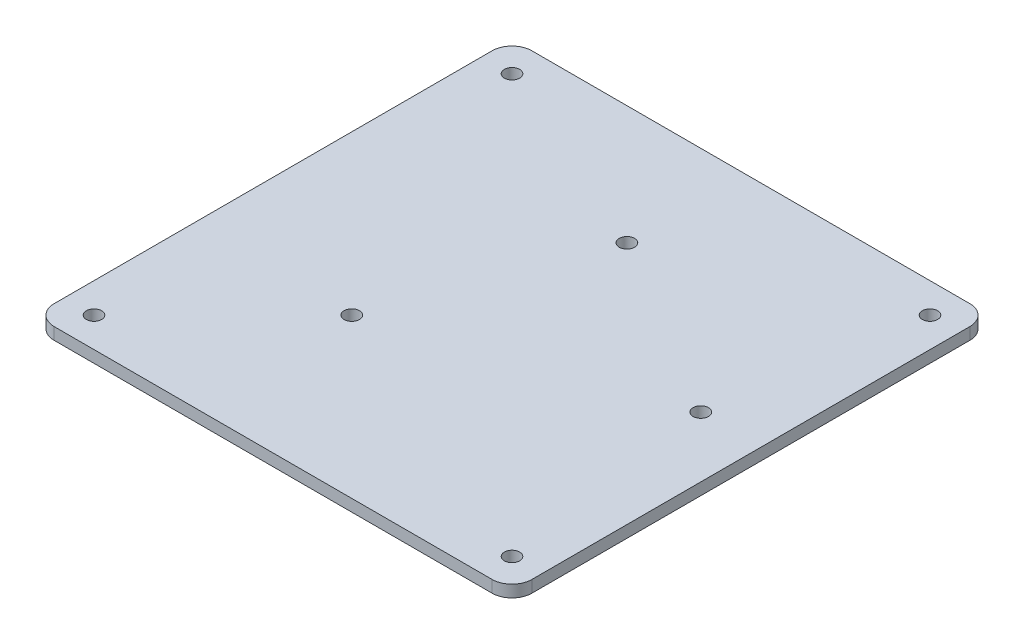
ISO-10303-21;
HEADER;
FILE_DESCRIPTION(('STEP AP214'),'2;1');
FILE_NAME('part.step','',(''),(''),'','','');
FILE_SCHEMA(('AUTOMOTIVE_DESIGN { 1 0 10303 214 1 1 1 1 }'));
ENDSEC;
DATA;
#1=APPLICATION_CONTEXT('core data for automotive mechanical design processes');
#2=APPLICATION_PROTOCOL_DEFINITION('international standard','automotive_design',2000,#1);
#3=PRODUCT_CONTEXT('',#1,'mechanical');
#4=PRODUCT('Part','Part','',(#3));
#5=PRODUCT_RELATED_PRODUCT_CATEGORY('part','',(#4));
#6=PRODUCT_DEFINITION_FORMATION('','',#4);
#7=PRODUCT_DEFINITION_CONTEXT('part definition',#1,'design');
#8=PRODUCT_DEFINITION('design','',#6,#7);
#9=PRODUCT_DEFINITION_SHAPE('','',#8);
#10=(LENGTH_UNIT() NAMED_UNIT(*) SI_UNIT(.MILLI.,.METRE.));
#11=(NAMED_UNIT(*) PLANE_ANGLE_UNIT() SI_UNIT($,.RADIAN.));
#12=(NAMED_UNIT(*) SI_UNIT($,.STERADIAN.) SOLID_ANGLE_UNIT());
#13=UNCERTAINTY_MEASURE_WITH_UNIT(LENGTH_MEASURE(1.E-05),#10,'distance_accuracy_value','');
#14=(GEOMETRIC_REPRESENTATION_CONTEXT(3) GLOBAL_UNCERTAINTY_ASSIGNED_CONTEXT((#13)) GLOBAL_UNIT_ASSIGNED_CONTEXT((#10,
#11,#12)) REPRESENTATION_CONTEXT('',''));
#15=CARTESIAN_POINT('',(0.,0.,0.));
#16=DIRECTION('',(0.,0.,1.));
#17=DIRECTION('',(1.,0.,0.));
#18=AXIS2_PLACEMENT_3D('',#15,#16,#17);
#19=CARTESIAN_POINT('',(-46.2541002310008,3.81,16.993426234333));
#20=DIRECTION('',(0.,1.,0.));
#21=DIRECTION('',(1.,0.,0.));
#22=AXIS2_PLACEMENT_3D('',#19,#20,#21);
#23=PLANE('',#22);
#24=CARTESIAN_POINT('',(-101.750340264647,3.81,34.3235777534356));
#25=DIRECTION('',(0.,1.,0.));
#26=DIRECTION('',(0.,0.,1.));
#27=AXIS2_PLACEMENT_3D('',#24,#25,#26);
#28=CIRCLE('',#27,2.45745);
#29=CARTESIAN_POINT('',(-101.750340264647,3.81,36.7810277534356));
#30=VERTEX_POINT('',#29);
#31=EDGE_CURVE('E145',#30,#30,#28,.T.);
#32=ORIENTED_EDGE('',*,*,#31,.F.);
#33=EDGE_LOOP('',(#32));
#34=FACE_BOUND('',#33,.T.);
#35=DIRECTION('',(0.,0.,1.));
#36=VECTOR('',#35,1.);
#37=CARTESIAN_POINT('',(0.,3.81000000000001,-67.4267625112118));
#38=LINE('',#37,#36);
#39=CARTESIAN_POINT('',(0.,3.81000000000001,-61.0767625112118));
#40=VERTEX_POINT('',#39);
#41=CARTESIAN_POINT('',(0.,3.80999999999999,78.6232374887882));
#42=VERTEX_POINT('',#41);
#43=EDGE_CURVE('E103',#40,#42,#38,.T.);
#44=ORIENTED_EDGE('',*,*,#43,.F.);
#45=CARTESIAN_POINT('',(-6.35,3.81000000000001,-61.0767625112118));
#46=DIRECTION('',(0.,1.,0.));
#47=DIRECTION('',(1.,0.,0.));
#48=AXIS2_PLACEMENT_3D('',#45,#46,#47);
#49=CIRCLE('',#48,6.35);
#50=CARTESIAN_POINT('',(-6.35,3.81000000000001,-67.4267625112118));
#51=VERTEX_POINT('',#50);
#52=EDGE_CURVE('E108',#51,#40,#49,.F.);
#53=ORIENTED_EDGE('',*,*,#52,.F.);
#54=DIRECTION('',(1.,0.,0.));
#55=VECTOR('',#54,1.);
#56=CARTESIAN_POINT('',(0.,3.81000000000001,-67.4267625112118));
#57=LINE('',#56,#55);
#58=CARTESIAN_POINT('',(-146.05,3.81000000000001,-67.4267625112118));
#59=VERTEX_POINT('',#58);
#60=EDGE_CURVE('E115',#59,#51,#57,.T.);
#61=ORIENTED_EDGE('',*,*,#60,.F.);
#62=CARTESIAN_POINT('',(-146.05,3.81000000000001,-61.0767625112118));
#63=DIRECTION('',(0.,-1.,0.));
#64=DIRECTION('',(-1.,0.,0.));
#65=AXIS2_PLACEMENT_3D('',#62,#63,#64);
#66=CIRCLE('',#65,6.35);
#67=CARTESIAN_POINT('',(-152.4,3.81000000000001,-61.0767625112118));
#68=VERTEX_POINT('',#67);
#69=EDGE_CURVE('E158',#59,#68,#66,.F.);
#70=ORIENTED_EDGE('',*,*,#69,.T.);
#71=DIRECTION('',(0.,0.,1.));
#72=VECTOR('',#71,1.);
#73=CARTESIAN_POINT('',(-152.4,3.81000000000001,-67.4267625112118));
#74=LINE('',#73,#72);
#75=CARTESIAN_POINT('',(-152.4,3.81,78.6232374887882));
#76=VERTEX_POINT('',#75);
#77=EDGE_CURVE('E116',#68,#76,#74,.T.);
#78=ORIENTED_EDGE('',*,*,#77,.T.);
#79=CARTESIAN_POINT('',(-146.05,3.81,78.6232374887882));
#80=DIRECTION('',(0.,-1.,0.));
#81=DIRECTION('',(-1.,0.,0.));
#82=AXIS2_PLACEMENT_3D('',#79,#80,#81);
#83=CIRCLE('',#82,6.35);
#84=CARTESIAN_POINT('',(-146.05,3.81,84.9732374887882));
#85=VERTEX_POINT('',#84);
#86=EDGE_CURVE('E160',#76,#85,#83,.F.);
#87=ORIENTED_EDGE('',*,*,#86,.T.);
#88=DIRECTION('',(1.,0.,0.));
#89=VECTOR('',#88,1.);
#90=CARTESIAN_POINT('',(0.,3.80999999999999,84.9732374887882));
#91=LINE('',#90,#89);
#92=CARTESIAN_POINT('',(-6.35,3.80999999999999,84.9732374887882));
#93=VERTEX_POINT('',#92);
#94=EDGE_CURVE('E180',#85,#93,#91,.T.);
#95=ORIENTED_EDGE('',*,*,#94,.T.);
#96=CARTESIAN_POINT('',(-6.35,3.80999999999999,78.6232374887882));
#97=DIRECTION('',(0.,-1.,0.));
#98=DIRECTION('',(-1.,0.,0.));
#99=AXIS2_PLACEMENT_3D('',#96,#97,#98);
#100=CIRCLE('',#99,6.35);
#101=EDGE_CURVE('E111',#93,#42,#100,.F.);
#102=ORIENTED_EDGE('',*,*,#101,.T.);
#103=EDGE_LOOP('',(#44,#53,#61,#70,#78,#87,#95,#102));
#104=FACE_BOUND('',#103,.T.);
#105=CARTESIAN_POINT('',(-19.302860594839,3.81,5.43816370851094));
#106=DIRECTION('',(0.,1.,0.));
#107=DIRECTION('',(1.,0.,0.));
#108=AXIS2_PLACEMENT_3D('',#105,#106,#107);
#109=CIRCLE('',#108,2.45744999999999);
#110=CARTESIAN_POINT('',(-16.845410594839,3.81,5.43816370851094));
#111=VERTEX_POINT('',#110);
#112=EDGE_CURVE('E133',#111,#111,#109,.F.);
#113=ORIENTED_EDGE('',*,*,#112,.T.);
#114=EDGE_LOOP('',(#113));
#115=FACE_BOUND('',#114,.T.);
#116=CARTESIAN_POINT('',(-77.848643242643,3.81000000000001,-29.5244167762885));
#117=DIRECTION('',(0.,1.,0.));
#118=DIRECTION('',(1.,0.,0.));
#119=AXIS2_PLACEMENT_3D('',#116,#117,#118);
#120=CIRCLE('',#119,2.45744999999999);
#121=CARTESIAN_POINT('',(-75.3911932426431,3.81000000000001,-29.5244167762885));
#122=VERTEX_POINT('',#121);
#123=EDGE_CURVE('E139',#122,#122,#120,.F.);
#124=ORIENTED_EDGE('',*,*,#123,.T.);
#125=EDGE_LOOP('',(#124));
#126=FACE_BOUND('',#125,.T.);
#127=CARTESIAN_POINT('',(-9.52499999999998,3.81000000000001,-57.9017625112118));
#128=DIRECTION('',(0.,1.,0.));
#129=DIRECTION('',(1.,0.,0.));
#130=AXIS2_PLACEMENT_3D('',#127,#128,#129);
#131=CIRCLE('',#130,2.4384);
#132=CARTESIAN_POINT('',(-7.08659999999998,3.81000000000001,-57.9017625112118));
#133=VERTEX_POINT('',#132);
#134=EDGE_CURVE('E128',#133,#133,#131,.F.);
#135=ORIENTED_EDGE('',*,*,#134,.T.);
#136=EDGE_LOOP('',(#135));
#137=FACE_BOUND('',#136,.T.);
#138=CARTESIAN_POINT('',(-142.875,3.81,75.4482374887882));
#139=DIRECTION('',(0.,1.,0.));
#140=DIRECTION('',(1.,0.,0.));
#141=AXIS2_PLACEMENT_3D('',#138,#139,#140);
#142=CIRCLE('',#141,2.43840000000001);
#143=CARTESIAN_POINT('',(-140.4366,3.81,75.4482374887882));
#144=VERTEX_POINT('',#143);
#145=EDGE_CURVE('E198',#144,#144,#142,.T.);
#146=ORIENTED_EDGE('',*,*,#145,.F.);
#147=EDGE_LOOP('',(#146));
#148=FACE_BOUND('',#147,.T.);
#149=CARTESIAN_POINT('',(-9.52499999999996,3.80999999999999,75.4482374887882));
#150=DIRECTION('',(0.,1.,0.));
#151=DIRECTION('',(1.,0.,0.));
#152=AXIS2_PLACEMENT_3D('',#149,#150,#151);
#153=CIRCLE('',#152,2.4384);
#154=CARTESIAN_POINT('',(-7.08659999999996,3.80999999999999,75.4482374887882));
#155=VERTEX_POINT('',#154);
#156=EDGE_CURVE('E204',#155,#155,#153,.T.);
#157=ORIENTED_EDGE('',*,*,#156,.F.);
#158=EDGE_LOOP('',(#157));
#159=FACE_BOUND('',#158,.T.);
#160=CARTESIAN_POINT('',(-142.875,3.81000000000001,-57.9017625112118));
#161=DIRECTION('',(0.,1.,0.));
#162=DIRECTION('',(1.,0.,0.));
#163=AXIS2_PLACEMENT_3D('',#160,#161,#162);
#164=CIRCLE('',#163,2.4384);
#165=CARTESIAN_POINT('',(-140.4366,3.81000000000001,-57.9017625112118));
#166=VERTEX_POINT('',#165);
#167=EDGE_CURVE('E189',#166,#166,#164,.T.);
#168=ORIENTED_EDGE('',*,*,#167,.F.);
#169=EDGE_LOOP('',(#168));
#170=FACE_BOUND('',#169,.T.);
#171=ADVANCED_FACE('F36',(#34,#104,#115,#126,#137,#148,#159,#170),#23,.T.);
#172=CARTESIAN_POINT('',(0.,3.81000000000001,-67.4267625112118));
#173=DIRECTION('',(0.,0.,-1.));
#174=DIRECTION('',(-1.,0.,0.));
#175=AXIS2_PLACEMENT_3D('',#172,#173,#174);
#176=PLANE('',#175);
#177=ORIENTED_EDGE('',*,*,#60,.T.);
#178=DIRECTION('',(0.,-1.,0.));
#179=VECTOR('',#178,1.);
#180=CARTESIAN_POINT('',(-6.35,0.,-67.4267625112118));
#181=LINE('',#180,#179);
#182=CARTESIAN_POINT('',(-6.35,0.,-67.4267625112118));
#183=VERTEX_POINT('',#182);
#184=EDGE_CURVE('E39',#51,#183,#181,.T.);
#185=ORIENTED_EDGE('',*,*,#184,.T.);
#186=DIRECTION('',(-1.,0.,0.));
#187=VECTOR('',#186,1.);
#188=CARTESIAN_POINT('',(0.,0.,-67.4267625112118));
#189=LINE('',#188,#187);
#190=CARTESIAN_POINT('',(-146.05,0.,-67.4267625112118));
#191=VERTEX_POINT('',#190);
#192=EDGE_CURVE('E183',#183,#191,#189,.T.);
#193=ORIENTED_EDGE('',*,*,#192,.T.);
#194=DIRECTION('',(0.,1.,0.));
#195=VECTOR('',#194,1.);
#196=CARTESIAN_POINT('',(-146.05,3.81000000000001,-67.4267625112118));
#197=LINE('',#196,#195);
#198=EDGE_CURVE('E171',#191,#59,#197,.T.);
#199=ORIENTED_EDGE('',*,*,#198,.T.);
#200=EDGE_LOOP('',(#177,#185,#193,#199));
#201=FACE_BOUND('',#200,.T.);
#202=ADVANCED_FACE('F222',(#201),#176,.T.);
#203=CARTESIAN_POINT('',(-146.05,3.81000000000001,-61.0767625112118));
#204=DIRECTION('',(0.,-1.,0.));
#205=DIRECTION('',(-1.,0.,0.));
#206=AXIS2_PLACEMENT_3D('',#203,#204,#205);
#207=CYLINDRICAL_SURFACE('',#206,6.35);
#208=CARTESIAN_POINT('',(-146.05,0.,-61.0767625112118));
#209=DIRECTION('',(0.,1.,0.));
#210=DIRECTION('',(1.,0.,0.));
#211=AXIS2_PLACEMENT_3D('',#208,#209,#210);
#212=CIRCLE('',#211,6.35);
#213=CARTESIAN_POINT('',(-152.4,0.,-61.0767625112118));
#214=VERTEX_POINT('',#213);
#215=EDGE_CURVE('E59',#214,#191,#212,.F.);
#216=ORIENTED_EDGE('',*,*,#215,.F.);
#217=DIRECTION('',(0.,1.,0.));
#218=VECTOR('',#217,1.);
#219=CARTESIAN_POINT('',(-152.4,0.,-61.0767625112118));
#220=LINE('',#219,#218);
#221=EDGE_CURVE('E153',#68,#214,#220,.F.);
#222=ORIENTED_EDGE('',*,*,#221,.F.);
#223=ORIENTED_EDGE('',*,*,#69,.F.);
#224=ORIENTED_EDGE('',*,*,#198,.F.);
#225=EDGE_LOOP('',(#216,#222,#223,#224));
#226=FACE_BOUND('',#225,.T.);
#227=ADVANCED_FACE('F262',(#226),#207,.T.);
#228=CARTESIAN_POINT('',(-152.4,3.81000000000001,-67.4267625112118));
#229=DIRECTION('',(1.,0.,0.));
#230=DIRECTION('',(0.,0.,-1.));
#231=AXIS2_PLACEMENT_3D('',#228,#229,#230);
#232=PLANE('',#231);
#233=ORIENTED_EDGE('',*,*,#77,.F.);
#234=ORIENTED_EDGE('',*,*,#221,.T.);
#235=DIRECTION('',(0.,0.,1.));
#236=VECTOR('',#235,1.);
#237=CARTESIAN_POINT('',(-152.4,0.,-67.4267625112118));
#238=LINE('',#237,#236);
#239=CARTESIAN_POINT('',(-152.4,0.,78.6232374887882));
#240=VERTEX_POINT('',#239);
#241=EDGE_CURVE('E175',#214,#240,#238,.T.);
#242=ORIENTED_EDGE('',*,*,#241,.T.);
#243=DIRECTION('',(0.,1.,0.));
#244=VECTOR('',#243,1.);
#245=CARTESIAN_POINT('',(-152.4,3.81,78.6232374887882));
#246=LINE('',#245,#244);
#247=EDGE_CURVE('E155',#240,#76,#246,.T.);
#248=ORIENTED_EDGE('',*,*,#247,.T.);
#249=EDGE_LOOP('',(#233,#234,#242,#248));
#250=FACE_BOUND('',#249,.T.);
#251=ADVANCED_FACE('F276',(#250),#232,.F.);
#252=CARTESIAN_POINT('',(-146.05,3.81,78.6232374887882));
#253=DIRECTION('',(0.,1.,0.));
#254=DIRECTION('',(1.,0.,0.));
#255=AXIS2_PLACEMENT_3D('',#252,#253,#254);
#256=CYLINDRICAL_SURFACE('',#255,6.35);
#257=CARTESIAN_POINT('',(-146.05,0.,78.6232374887882));
#258=DIRECTION('',(0.,1.,0.));
#259=DIRECTION('',(1.,0.,0.));
#260=AXIS2_PLACEMENT_3D('',#257,#258,#259);
#261=CIRCLE('',#260,6.35);
#262=CARTESIAN_POINT('',(-146.05,0.,84.9732374887882));
#263=VERTEX_POINT('',#262);
#264=EDGE_CURVE('E167',#263,#240,#261,.F.);
#265=ORIENTED_EDGE('',*,*,#264,.F.);
#266=DIRECTION('',(0.,1.,0.));
#267=VECTOR('',#266,1.);
#268=CARTESIAN_POINT('',(-146.05,3.81,84.9732374887882));
#269=LINE('',#268,#267);
#270=EDGE_CURVE('E127',#85,#263,#269,.F.);
#271=ORIENTED_EDGE('',*,*,#270,.F.);
#272=ORIENTED_EDGE('',*,*,#86,.F.);
#273=ORIENTED_EDGE('',*,*,#247,.F.);
#274=EDGE_LOOP('',(#265,#271,#272,#273));
#275=FACE_BOUND('',#274,.T.);
#276=ADVANCED_FACE('F278',(#275),#256,.T.);
#277=CARTESIAN_POINT('',(0.,3.80999999999999,84.9732374887882));
#278=DIRECTION('',(0.,0.,-1.));
#279=DIRECTION('',(-1.,0.,0.));
#280=AXIS2_PLACEMENT_3D('',#277,#278,#279);
#281=PLANE('',#280);
#282=ORIENTED_EDGE('',*,*,#94,.F.);
#283=ORIENTED_EDGE('',*,*,#270,.T.);
#284=DIRECTION('',(-1.,0.,0.));
#285=VECTOR('',#284,1.);
#286=CARTESIAN_POINT('',(0.,0.,84.9732374887882));
#287=LINE('',#286,#285);
#288=CARTESIAN_POINT('',(-6.35,0.,84.9732374887882));
#289=VERTEX_POINT('',#288);
#290=EDGE_CURVE('E182',#289,#263,#287,.T.);
#291=ORIENTED_EDGE('',*,*,#290,.F.);
#292=DIRECTION('',(0.,-1.,0.));
#293=VECTOR('',#292,1.);
#294=CARTESIAN_POINT('',(-6.35,3.80999999999999,84.9732374887882));
#295=LINE('',#294,#293);
#296=EDGE_CURVE('E130',#289,#93,#295,.F.);
#297=ORIENTED_EDGE('',*,*,#296,.T.);
#298=EDGE_LOOP('',(#282,#283,#291,#297));
#299=FACE_BOUND('',#298,.T.);
#300=ADVANCED_FACE('F249',(#299),#281,.F.);
#301=CARTESIAN_POINT('',(-6.35,3.81000000000001,-61.0767625112118));
#302=DIRECTION('',(0.,1.,0.));
#303=DIRECTION('',(1.,0.,0.));
#304=AXIS2_PLACEMENT_3D('',#301,#302,#303);
#305=CYLINDRICAL_SURFACE('',#304,6.35);
#306=ORIENTED_EDGE('',*,*,#184,.F.);
#307=ORIENTED_EDGE('',*,*,#52,.T.);
#308=DIRECTION('',(0.,-1.,0.));
#309=VECTOR('',#308,1.);
#310=CARTESIAN_POINT('',(0.,3.81000000000001,-61.0767625112118));
#311=LINE('',#310,#309);
#312=CARTESIAN_POINT('',(0.,0.,-61.0767625112118));
#313=VERTEX_POINT('',#312);
#314=EDGE_CURVE('E120',#313,#40,#311,.F.);
#315=ORIENTED_EDGE('',*,*,#314,.F.);
#316=CARTESIAN_POINT('',(-6.35,0.,-61.0767625112118));
#317=DIRECTION('',(0.,1.,0.));
#318=DIRECTION('',(1.,0.,0.));
#319=AXIS2_PLACEMENT_3D('',#316,#317,#318);
#320=CIRCLE('',#319,6.35);
#321=EDGE_CURVE('E164',#183,#313,#320,.F.);
#322=ORIENTED_EDGE('',*,*,#321,.F.);
#323=EDGE_LOOP('',(#306,#307,#315,#322));
#324=FACE_BOUND('',#323,.T.);
#325=ADVANCED_FACE('F126',(#324),#305,.T.);
#326=CARTESIAN_POINT('',(0.,0.,-67.4267625112118));
#327=DIRECTION('',(0.,1.,0.));
#328=DIRECTION('',(1.,0.,0.));
#329=AXIS2_PLACEMENT_3D('',#326,#327,#328);
#330=PLANE('',#329);
#331=CARTESIAN_POINT('',(-101.750340264647,0.,34.3235777534356));
#332=DIRECTION('',(0.,1.,0.));
#333=DIRECTION('',(0.,0.,1.));
#334=AXIS2_PLACEMENT_3D('',#331,#332,#333);
#335=CIRCLE('',#334,2.45745);
#336=CARTESIAN_POINT('',(-101.750340264647,0.,36.7810277534356));
#337=VERTEX_POINT('',#336);
#338=EDGE_CURVE('E141',#337,#337,#335,.T.);
#339=ORIENTED_EDGE('',*,*,#338,.T.);
#340=EDGE_LOOP('',(#339));
#341=FACE_BOUND('',#340,.T.);
#342=CARTESIAN_POINT('',(-77.848643242643,0.,-29.5244167762885));
#343=DIRECTION('',(0.,1.,0.));
#344=DIRECTION('',(1.,0.,0.));
#345=AXIS2_PLACEMENT_3D('',#342,#343,#344);
#346=CIRCLE('',#345,2.45744999999999);
#347=CARTESIAN_POINT('',(-75.3911932426431,0.,-29.5244167762885));
#348=VERTEX_POINT('',#347);
#349=EDGE_CURVE('E11',#348,#348,#346,.T.);
#350=ORIENTED_EDGE('',*,*,#349,.T.);
#351=EDGE_LOOP('',(#350));
#352=FACE_BOUND('',#351,.T.);
#353=CARTESIAN_POINT('',(-19.302860594839,0.,5.43816370851094));
#354=DIRECTION('',(0.,1.,0.));
#355=DIRECTION('',(1.,0.,0.));
#356=AXIS2_PLACEMENT_3D('',#353,#354,#355);
#357=CIRCLE('',#356,2.45744999999999);
#358=CARTESIAN_POINT('',(-16.845410594839,0.,5.43816370851094));
#359=VERTEX_POINT('',#358);
#360=EDGE_CURVE('E44',#359,#359,#357,.T.);
#361=ORIENTED_EDGE('',*,*,#360,.T.);
#362=EDGE_LOOP('',(#361));
#363=FACE_BOUND('',#362,.T.);
#364=CARTESIAN_POINT('',(-142.875,0.,75.4482374887882));
#365=DIRECTION('',(0.,1.,0.));
#366=DIRECTION('',(1.,0.,0.));
#367=AXIS2_PLACEMENT_3D('',#364,#365,#366);
#368=CIRCLE('',#367,2.43840000000001);
#369=CARTESIAN_POINT('',(-140.4366,0.,75.4482374887882));
#370=VERTEX_POINT('',#369);
#371=EDGE_CURVE('E195',#370,#370,#368,.T.);
#372=ORIENTED_EDGE('',*,*,#371,.T.);
#373=EDGE_LOOP('',(#372));
#374=FACE_BOUND('',#373,.T.);
#375=CARTESIAN_POINT('',(-9.52499999999996,0.,75.4482374887882));
#376=DIRECTION('',(0.,1.,0.));
#377=DIRECTION('',(1.,0.,0.));
#378=AXIS2_PLACEMENT_3D('',#375,#376,#377);
#379=CIRCLE('',#378,2.4384);
#380=CARTESIAN_POINT('',(-7.08659999999996,0.,75.4482374887882));
#381=VERTEX_POINT('',#380);
#382=EDGE_CURVE('E201',#381,#381,#379,.T.);
#383=ORIENTED_EDGE('',*,*,#382,.T.);
#384=EDGE_LOOP('',(#383));
#385=FACE_BOUND('',#384,.T.);
#386=CARTESIAN_POINT('',(-9.52499999999998,0.,-57.9017625112118));
#387=DIRECTION('',(0.,1.,0.));
#388=DIRECTION('',(1.,0.,0.));
#389=AXIS2_PLACEMENT_3D('',#386,#387,#388);
#390=CIRCLE('',#389,2.4384);
#391=CARTESIAN_POINT('',(-7.08659999999998,0.,-57.9017625112118));
#392=VERTEX_POINT('',#391);
#393=EDGE_CURVE('E192',#392,#392,#390,.T.);
#394=ORIENTED_EDGE('',*,*,#393,.T.);
#395=EDGE_LOOP('',(#394));
#396=FACE_BOUND('',#395,.T.);
#397=CARTESIAN_POINT('',(-142.875,0.,-57.9017625112118));
#398=DIRECTION('',(0.,1.,0.));
#399=DIRECTION('',(1.,0.,0.));
#400=AXIS2_PLACEMENT_3D('',#397,#398,#399);
#401=CIRCLE('',#400,2.4384);
#402=CARTESIAN_POINT('',(-140.4366,0.,-57.9017625112118));
#403=VERTEX_POINT('',#402);
#404=EDGE_CURVE('E186',#403,#403,#401,.T.);
#405=ORIENTED_EDGE('',*,*,#404,.T.);
#406=EDGE_LOOP('',(#405));
#407=FACE_BOUND('',#406,.T.);
#408=ORIENTED_EDGE('',*,*,#192,.F.);
#409=ORIENTED_EDGE('',*,*,#321,.T.);
#410=DIRECTION('',(0.,0.,1.));
#411=VECTOR('',#410,1.);
#412=CARTESIAN_POINT('',(0.,0.,-67.4267625112118));
#413=LINE('',#412,#411);
#414=CARTESIAN_POINT('',(0.,0.,78.6232374887882));
#415=VERTEX_POINT('',#414);
#416=EDGE_CURVE('E123',#313,#415,#413,.T.);
#417=ORIENTED_EDGE('',*,*,#416,.T.);
#418=CARTESIAN_POINT('',(-6.35,0.,78.6232374887882));
#419=DIRECTION('',(0.,1.,0.));
#420=DIRECTION('',(1.,0.,0.));
#421=AXIS2_PLACEMENT_3D('',#418,#419,#420);
#422=CIRCLE('',#421,6.35);
#423=EDGE_CURVE('E169',#415,#289,#422,.F.);
#424=ORIENTED_EDGE('',*,*,#423,.T.);
#425=ORIENTED_EDGE('',*,*,#290,.T.);
#426=ORIENTED_EDGE('',*,*,#264,.T.);
#427=ORIENTED_EDGE('',*,*,#241,.F.);
#428=ORIENTED_EDGE('',*,*,#215,.T.);
#429=EDGE_LOOP('',(#408,#409,#417,#424,#425,#426,#427,#428));
#430=FACE_BOUND('',#429,.T.);
#431=ADVANCED_FACE('F211',(#341,#352,#363,#374,#385,#396,#407,#430),#330,.F.);
#432=CARTESIAN_POINT('',(-77.848643242643,3.81000000000001,-29.5244167762885));
#433=DIRECTION('',(0.,1.,0.));
#434=DIRECTION('',(1.,0.,0.));
#435=AXIS2_PLACEMENT_3D('',#432,#433,#434);
#436=CYLINDRICAL_SURFACE('',#435,2.45744999999999);
#437=ORIENTED_EDGE('',*,*,#349,.F.);
#438=EDGE_LOOP('',(#437));
#439=FACE_BOUND('',#438,.T.);
#440=ORIENTED_EDGE('',*,*,#123,.F.);
#441=EDGE_LOOP('',(#440));
#442=FACE_BOUND('',#441,.T.);
#443=ADVANCED_FACE('F218',(#439,#442),#436,.F.);
#444=CARTESIAN_POINT('',(-19.302860594839,3.81,5.43816370851094));
#445=DIRECTION('',(0.,1.,0.));
#446=DIRECTION('',(1.,0.,0.));
#447=AXIS2_PLACEMENT_3D('',#444,#445,#446);
#448=CYLINDRICAL_SURFACE('',#447,2.45744999999999);
#449=ORIENTED_EDGE('',*,*,#360,.F.);
#450=EDGE_LOOP('',(#449));
#451=FACE_BOUND('',#450,.T.);
#452=ORIENTED_EDGE('',*,*,#112,.F.);
#453=EDGE_LOOP('',(#452));
#454=FACE_BOUND('',#453,.T.);
#455=ADVANCED_FACE('F214',(#451,#454),#448,.F.);
#456=CARTESIAN_POINT('',(-9.52499999999998,0.,-57.9017625112118));
#457=DIRECTION('',(0.,1.,0.));
#458=DIRECTION('',(1.,0.,0.));
#459=AXIS2_PLACEMENT_3D('',#456,#457,#458);
#460=CYLINDRICAL_SURFACE('',#459,2.4384);
#461=CARTESIAN_POINT('',(-7.08659999999998,0.,-57.9017625112118));
#462=CARTESIAN_POINT('',(-7.08659999999998,0.0396875000000064,-57.9017625112118));
#463=CARTESIAN_POINT('',(-7.08659999999998,0.0793750000000064,-57.9017625112118));
#464=CARTESIAN_POINT('',(-7.08659999999998,0.158750000000006,-57.9017625112118));
#465=CARTESIAN_POINT('',(-7.08659999999998,0.198437500000006,-57.9017625112118));
#466=CARTESIAN_POINT('',(-7.08659999999998,0.277812500000006,-57.9017625112118));
#467=CARTESIAN_POINT('',(-7.08659999999998,0.317500000000006,-57.9017625112118));
#468=CARTESIAN_POINT('',(-7.08659999999998,0.396875000000006,-57.9017625112118));
#469=CARTESIAN_POINT('',(-7.08659999999998,0.436562500000006,-57.9017625112118));
#470=CARTESIAN_POINT('',(-7.08659999999998,0.515937500000006,-57.9017625112118));
#471=CARTESIAN_POINT('',(-7.08659999999998,0.555625000000006,-57.9017625112118));
#472=CARTESIAN_POINT('',(-7.08659999999998,0.635000000000006,-57.9017625112118));
#473=CARTESIAN_POINT('',(-7.08659999999998,0.674687500000006,-57.9017625112118));
#474=CARTESIAN_POINT('',(-7.08659999999998,0.754062500000006,-57.9017625112118));
#475=CARTESIAN_POINT('',(-7.08659999999998,0.793750000000006,-57.9017625112118));
#476=CARTESIAN_POINT('',(-7.08659999999998,0.873125000000006,-57.9017625112118));
#477=CARTESIAN_POINT('',(-7.08659999999998,0.912812500000006,-57.9017625112118));
#478=CARTESIAN_POINT('',(-7.08659999999998,0.992187500000006,-57.9017625112118));
#479=CARTESIAN_POINT('',(-7.08659999999998,1.03187500000001,-57.9017625112118));
#480=CARTESIAN_POINT('',(-7.08659999999998,1.11125000000001,-57.9017625112118));
#481=CARTESIAN_POINT('',(-7.08659999999998,1.15093750000001,-57.9017625112118));
#482=CARTESIAN_POINT('',(-7.08659999999998,1.23031250000001,-57.9017625112118));
#483=CARTESIAN_POINT('',(-7.08659999999998,1.27000000000001,-57.9017625112118));
#484=CARTESIAN_POINT('',(-7.08659999999998,1.34937500000001,-57.9017625112118));
#485=CARTESIAN_POINT('',(-7.08659999999998,1.38906250000001,-57.9017625112118));
#486=CARTESIAN_POINT('',(-7.08659999999998,1.46843750000001,-57.9017625112118));
#487=CARTESIAN_POINT('',(-7.08659999999998,1.50812500000001,-57.9017625112118));
#488=CARTESIAN_POINT('',(-7.08659999999998,1.58750000000001,-57.9017625112118));
#489=CARTESIAN_POINT('',(-7.08659999999998,1.62718750000001,-57.9017625112118));
#490=CARTESIAN_POINT('',(-7.08659999999998,1.70656250000001,-57.9017625112118));
#491=CARTESIAN_POINT('',(-7.08659999999998,1.74625000000001,-57.9017625112118));
#492=CARTESIAN_POINT('',(-7.08659999999998,1.82562500000001,-57.9017625112118));
#493=CARTESIAN_POINT('',(-7.08659999999998,1.86531250000001,-57.9017625112118));
#494=CARTESIAN_POINT('',(-7.08659999999998,1.94468750000001,-57.9017625112118));
#495=CARTESIAN_POINT('',(-7.08659999999998,1.98437500000001,-57.9017625112118));
#496=CARTESIAN_POINT('',(-7.08659999999998,2.06375000000001,-57.9017625112118));
#497=CARTESIAN_POINT('',(-7.08659999999998,2.10343750000001,-57.9017625112118));
#498=CARTESIAN_POINT('',(-7.08659999999998,2.18281250000001,-57.9017625112118));
#499=CARTESIAN_POINT('',(-7.08659999999998,2.22250000000001,-57.9017625112118));
#500=CARTESIAN_POINT('',(-7.08659999999998,2.30187500000001,-57.9017625112118));
#501=CARTESIAN_POINT('',(-7.08659999999998,2.34156250000001,-57.9017625112118));
#502=CARTESIAN_POINT('',(-7.08659999999998,2.42093750000001,-57.9017625112118));
#503=CARTESIAN_POINT('',(-7.08659999999998,2.46062500000001,-57.9017625112118));
#504=CARTESIAN_POINT('',(-7.08659999999998,2.54000000000001,-57.9017625112118));
#505=CARTESIAN_POINT('',(-7.08659999999998,2.57968750000001,-57.9017625112118));
#506=CARTESIAN_POINT('',(-7.08659999999998,2.65906250000001,-57.9017625112118));
#507=CARTESIAN_POINT('',(-7.08659999999998,2.69875000000001,-57.9017625112118));
#508=CARTESIAN_POINT('',(-7.08659999999998,2.77812500000001,-57.9017625112118));
#509=CARTESIAN_POINT('',(-7.08659999999998,2.81781250000001,-57.9017625112118));
#510=CARTESIAN_POINT('',(-7.08659999999998,2.89718750000001,-57.9017625112118));
#511=CARTESIAN_POINT('',(-7.08659999999998,2.93687500000001,-57.9017625112118));
#512=CARTESIAN_POINT('',(-7.08659999999998,3.01625000000001,-57.9017625112118));
#513=CARTESIAN_POINT('',(-7.08659999999998,3.05593750000001,-57.9017625112118));
#514=CARTESIAN_POINT('',(-7.08659999999998,3.13531250000001,-57.9017625112118));
#515=CARTESIAN_POINT('',(-7.08659999999998,3.17500000000001,-57.9017625112118));
#516=CARTESIAN_POINT('',(-7.08659999999998,3.25437500000001,-57.9017625112118));
#517=CARTESIAN_POINT('',(-7.08659999999998,3.29406250000001,-57.9017625112118));
#518=CARTESIAN_POINT('',(-7.08659999999998,3.37343750000001,-57.9017625112118));
#519=CARTESIAN_POINT('',(-7.08659999999998,3.41312500000001,-57.9017625112118));
#520=CARTESIAN_POINT('',(-7.08659999999998,3.49250000000001,-57.9017625112118));
#521=CARTESIAN_POINT('',(-7.08659999999998,3.53218750000001,-57.9017625112118));
#522=CARTESIAN_POINT('',(-7.08659999999998,3.61156250000001,-57.9017625112118));
#523=CARTESIAN_POINT('',(-7.08659999999998,3.65125000000001,-57.9017625112118));
#524=CARTESIAN_POINT('',(-7.08659999999998,3.73062500000001,-57.9017625112118));
#525=CARTESIAN_POINT('',(-7.08659999999998,3.77031250000001,-57.9017625112118));
#526=CARTESIAN_POINT('',(-7.08659999999998,3.81000000000001,-57.9017625112118));
#527=B_SPLINE_CURVE_WITH_KNOTS('',3,(#461,#462,#463,#464,#465,#466,#467,#468,#469,#470,#471,
#472,#473,#474,#475,#476,#477,#478,#479,#480,#481,#482,#483,#484,#485,#486,#487,#488,#489,#490,
#491,#492,#493,#494,#495,#496,#497,#498,#499,#500,#501,#502,#503,#504,#505,#506,#507,#508,#509,
#510,#511,#512,#513,#514,#515,#516,#517,#518,#519,#520,#521,#522,#523,#524,#525,#526),
.UNSPECIFIED.,.F.,.F.,(4,2,2,2,2,2,2,2,2,2,2,2,2,2,2,2,2,2,2,2,2,2,2,2,2,2,2,2,2,2,2,2,4),(0.,
0.1190625,0.238125,0.3571875,0.47625,0.5953125,0.714375,0.8334375,0.9525,1.0715625,1.190625,
1.3096875,1.42875,1.5478125,1.666875,1.7859375,1.905,2.0240625,2.143125,2.2621875,2.38125,
2.5003125,2.619375,2.7384375,2.8575,2.9765625,3.095625,3.2146875,3.33375,3.4528125,3.571875,
3.6909375,3.81),.UNSPECIFIED.);
#528=EDGE_CURVE('BSEAM217',#392,#133,#527,.T.);
#529=ORIENTED_EDGE('',*,*,#393,.F.);
#530=ORIENTED_EDGE('',*,*,#134,.F.);
#531=ORIENTED_EDGE('',*,*,#528,.T.);
#532=ORIENTED_EDGE('',*,*,#528,.F.);
#533=EDGE_LOOP('',(#529,#531,#530,#532));
#534=FACE_BOUND('',#533,.T.);
#535=ADVANCED_FACE('F217',(#534),#460,.F.);
#536=CARTESIAN_POINT('',(-142.875,0.,-57.9017625112118));
#537=DIRECTION('',(0.,1.,0.));
#538=DIRECTION('',(1.,0.,0.));
#539=AXIS2_PLACEMENT_3D('',#536,#537,#538);
#540=CYLINDRICAL_SURFACE('',#539,2.4384);
#541=CARTESIAN_POINT('',(-140.4366,0.,-57.9017625112118));
#542=CARTESIAN_POINT('',(-140.4366,0.0396875000000134,-57.9017625112118));
#543=CARTESIAN_POINT('',(-140.4366,0.0793750000000133,-57.9017625112118));
#544=CARTESIAN_POINT('',(-140.4366,0.158750000000013,-57.9017625112118));
#545=CARTESIAN_POINT('',(-140.4366,0.198437500000013,-57.9017625112118));
#546=CARTESIAN_POINT('',(-140.4366,0.277812500000013,-57.9017625112118));
#547=CARTESIAN_POINT('',(-140.4366,0.317500000000013,-57.9017625112118));
#548=CARTESIAN_POINT('',(-140.4366,0.396875000000013,-57.9017625112118));
#549=CARTESIAN_POINT('',(-140.4366,0.436562500000013,-57.9017625112118));
#550=CARTESIAN_POINT('',(-140.4366,0.515937500000013,-57.9017625112118));
#551=CARTESIAN_POINT('',(-140.4366,0.555625000000013,-57.9017625112118));
#552=CARTESIAN_POINT('',(-140.4366,0.635000000000013,-57.9017625112118));
#553=CARTESIAN_POINT('',(-140.4366,0.674687500000013,-57.9017625112118));
#554=CARTESIAN_POINT('',(-140.4366,0.754062500000013,-57.9017625112118));
#555=CARTESIAN_POINT('',(-140.4366,0.793750000000013,-57.9017625112118));
#556=CARTESIAN_POINT('',(-140.4366,0.873125000000013,-57.9017625112118));
#557=CARTESIAN_POINT('',(-140.4366,0.912812500000013,-57.9017625112118));
#558=CARTESIAN_POINT('',(-140.4366,0.992187500000013,-57.9017625112118));
#559=CARTESIAN_POINT('',(-140.4366,1.03187500000001,-57.9017625112118));
#560=CARTESIAN_POINT('',(-140.4366,1.11125000000001,-57.9017625112118));
#561=CARTESIAN_POINT('',(-140.4366,1.15093750000001,-57.9017625112118));
#562=CARTESIAN_POINT('',(-140.4366,1.23031250000001,-57.9017625112118));
#563=CARTESIAN_POINT('',(-140.4366,1.27000000000001,-57.9017625112118));
#564=CARTESIAN_POINT('',(-140.4366,1.34937500000001,-57.9017625112118));
#565=CARTESIAN_POINT('',(-140.4366,1.38906250000001,-57.9017625112118));
#566=CARTESIAN_POINT('',(-140.4366,1.46843750000001,-57.9017625112118));
#567=CARTESIAN_POINT('',(-140.4366,1.50812500000001,-57.9017625112118));
#568=CARTESIAN_POINT('',(-140.4366,1.58750000000001,-57.9017625112118));
#569=CARTESIAN_POINT('',(-140.4366,1.62718750000001,-57.9017625112118));
#570=CARTESIAN_POINT('',(-140.4366,1.70656250000001,-57.9017625112118));
#571=CARTESIAN_POINT('',(-140.4366,1.74625000000001,-57.9017625112118));
#572=CARTESIAN_POINT('',(-140.4366,1.82562500000001,-57.9017625112118));
#573=CARTESIAN_POINT('',(-140.4366,1.86531250000001,-57.9017625112118));
#574=CARTESIAN_POINT('',(-140.4366,1.94468750000001,-57.9017625112118));
#575=CARTESIAN_POINT('',(-140.4366,1.98437500000001,-57.9017625112118));
#576=CARTESIAN_POINT('',(-140.4366,2.06375000000001,-57.9017625112118));
#577=CARTESIAN_POINT('',(-140.4366,2.10343750000001,-57.9017625112118));
#578=CARTESIAN_POINT('',(-140.4366,2.18281250000001,-57.9017625112118));
#579=CARTESIAN_POINT('',(-140.4366,2.22250000000001,-57.9017625112118));
#580=CARTESIAN_POINT('',(-140.4366,2.30187500000001,-57.9017625112118));
#581=CARTESIAN_POINT('',(-140.4366,2.34156250000001,-57.9017625112118));
#582=CARTESIAN_POINT('',(-140.4366,2.42093750000001,-57.9017625112118));
#583=CARTESIAN_POINT('',(-140.4366,2.46062500000001,-57.9017625112118));
#584=CARTESIAN_POINT('',(-140.4366,2.54000000000001,-57.9017625112118));
#585=CARTESIAN_POINT('',(-140.4366,2.57968750000001,-57.9017625112118));
#586=CARTESIAN_POINT('',(-140.4366,2.65906250000001,-57.9017625112118));
#587=CARTESIAN_POINT('',(-140.4366,2.69875000000001,-57.9017625112118));
#588=CARTESIAN_POINT('',(-140.4366,2.77812500000001,-57.9017625112118));
#589=CARTESIAN_POINT('',(-140.4366,2.81781250000001,-57.9017625112118));
#590=CARTESIAN_POINT('',(-140.4366,2.89718750000001,-57.9017625112118));
#591=CARTESIAN_POINT('',(-140.4366,2.93687500000001,-57.9017625112118));
#592=CARTESIAN_POINT('',(-140.4366,3.01625000000001,-57.9017625112118));
#593=CARTESIAN_POINT('',(-140.4366,3.05593750000001,-57.9017625112118));
#594=CARTESIAN_POINT('',(-140.4366,3.13531250000001,-57.9017625112118));
#595=CARTESIAN_POINT('',(-140.4366,3.17500000000001,-57.9017625112118));
#596=CARTESIAN_POINT('',(-140.4366,3.25437500000001,-57.9017625112118));
#597=CARTESIAN_POINT('',(-140.4366,3.29406250000001,-57.9017625112118));
#598=CARTESIAN_POINT('',(-140.4366,3.37343750000001,-57.9017625112118));
#599=CARTESIAN_POINT('',(-140.4366,3.41312500000001,-57.9017625112118));
#600=CARTESIAN_POINT('',(-140.4366,3.49250000000001,-57.9017625112118));
#601=CARTESIAN_POINT('',(-140.4366,3.53218750000001,-57.9017625112118));
#602=CARTESIAN_POINT('',(-140.4366,3.61156250000001,-57.9017625112118));
#603=CARTESIAN_POINT('',(-140.4366,3.65125000000001,-57.9017625112118));
#604=CARTESIAN_POINT('',(-140.4366,3.73062500000001,-57.9017625112118));
#605=CARTESIAN_POINT('',(-140.4366,3.77031250000001,-57.9017625112118));
#606=CARTESIAN_POINT('',(-140.4366,3.81000000000001,-57.9017625112118));
#607=B_SPLINE_CURVE_WITH_KNOTS('',3,(#541,#542,#543,#544,#545,#546,#547,#548,#549,#550,#551,
#552,#553,#554,#555,#556,#557,#558,#559,#560,#561,#562,#563,#564,#565,#566,#567,#568,#569,#570,
#571,#572,#573,#574,#575,#576,#577,#578,#579,#580,#581,#582,#583,#584,#585,#586,#587,#588,#589,
#590,#591,#592,#593,#594,#595,#596,#597,#598,#599,#600,#601,#602,#603,#604,#605,#606),
.UNSPECIFIED.,.F.,.F.,(4,2,2,2,2,2,2,2,2,2,2,2,2,2,2,2,2,2,2,2,2,2,2,2,2,2,2,2,2,2,2,2,4),(0.,
0.1190625,0.238125,0.3571875,0.47625,0.5953125,0.714375,0.8334375,0.9525,1.0715625,1.190625,
1.3096875,1.42875,1.5478125,1.666875,1.7859375,1.905,2.0240625,2.143125,2.2621875,2.38125,
2.5003125,2.619375,2.7384375,2.8575,2.9765625,3.095625,3.2146875,3.33375,3.4528125,3.571875,
3.6909375,3.81),.UNSPECIFIED.);
#608=EDGE_CURVE('BSEAM233',#403,#166,#607,.T.);
#609=ORIENTED_EDGE('',*,*,#404,.F.);
#610=ORIENTED_EDGE('',*,*,#167,.T.);
#611=ORIENTED_EDGE('',*,*,#608,.T.);
#612=ORIENTED_EDGE('',*,*,#608,.F.);
#613=EDGE_LOOP('',(#609,#611,#610,#612));
#614=FACE_BOUND('',#613,.T.);
#615=ADVANCED_FACE('F233',(#614),#540,.F.);
#616=CARTESIAN_POINT('',(-9.52499999999996,0.,75.4482374887882));
#617=DIRECTION('',(0.,1.,0.));
#618=DIRECTION('',(1.,0.,0.));
#619=AXIS2_PLACEMENT_3D('',#616,#617,#618);
#620=CYLINDRICAL_SURFACE('',#619,2.4384);
#621=CARTESIAN_POINT('',(-7.08659999999996,0.,75.4482374887882));
#622=CARTESIAN_POINT('',(-7.08659999999996,0.0396874999999912,75.4482374887882));
#623=CARTESIAN_POINT('',(-7.08659999999996,0.0793749999999912,75.4482374887882));
#624=CARTESIAN_POINT('',(-7.08659999999996,0.158749999999991,75.4482374887882));
#625=CARTESIAN_POINT('',(-7.08659999999996,0.198437499999991,75.4482374887882));
#626=CARTESIAN_POINT('',(-7.08659999999996,0.277812499999991,75.4482374887882));
#627=CARTESIAN_POINT('',(-7.08659999999996,0.317499999999991,75.4482374887882));
#628=CARTESIAN_POINT('',(-7.08659999999996,0.396874999999991,75.4482374887882));
#629=CARTESIAN_POINT('',(-7.08659999999996,0.436562499999991,75.4482374887882));
#630=CARTESIAN_POINT('',(-7.08659999999996,0.515937499999991,75.4482374887882));
#631=CARTESIAN_POINT('',(-7.08659999999996,0.555624999999991,75.4482374887882));
#632=CARTESIAN_POINT('',(-7.08659999999996,0.634999999999991,75.4482374887882));
#633=CARTESIAN_POINT('',(-7.08659999999996,0.674687499999991,75.4482374887882));
#634=CARTESIAN_POINT('',(-7.08659999999996,0.754062499999991,75.4482374887882));
#635=CARTESIAN_POINT('',(-7.08659999999996,0.793749999999991,75.4482374887882));
#636=CARTESIAN_POINT('',(-7.08659999999996,0.873124999999991,75.4482374887882));
#637=CARTESIAN_POINT('',(-7.08659999999996,0.912812499999991,75.4482374887882));
#638=CARTESIAN_POINT('',(-7.08659999999996,0.992187499999991,75.4482374887882));
#639=CARTESIAN_POINT('',(-7.08659999999996,1.03187499999999,75.4482374887882));
#640=CARTESIAN_POINT('',(-7.08659999999996,1.11124999999999,75.4482374887882));
#641=CARTESIAN_POINT('',(-7.08659999999996,1.15093749999999,75.4482374887882));
#642=CARTESIAN_POINT('',(-7.08659999999996,1.23031249999999,75.4482374887882));
#643=CARTESIAN_POINT('',(-7.08659999999996,1.26999999999999,75.4482374887882));
#644=CARTESIAN_POINT('',(-7.08659999999996,1.34937499999999,75.4482374887882));
#645=CARTESIAN_POINT('',(-7.08659999999996,1.38906249999999,75.4482374887882));
#646=CARTESIAN_POINT('',(-7.08659999999996,1.46843749999999,75.4482374887882));
#647=CARTESIAN_POINT('',(-7.08659999999996,1.50812499999999,75.4482374887882));
#648=CARTESIAN_POINT('',(-7.08659999999996,1.58749999999999,75.4482374887882));
#649=CARTESIAN_POINT('',(-7.08659999999996,1.62718749999999,75.4482374887882));
#650=CARTESIAN_POINT('',(-7.08659999999996,1.70656249999999,75.4482374887882));
#651=CARTESIAN_POINT('',(-7.08659999999996,1.74624999999999,75.4482374887882));
#652=CARTESIAN_POINT('',(-7.08659999999996,1.82562499999999,75.4482374887882));
#653=CARTESIAN_POINT('',(-7.08659999999996,1.86531249999999,75.4482374887882));
#654=CARTESIAN_POINT('',(-7.08659999999996,1.94468749999999,75.4482374887882));
#655=CARTESIAN_POINT('',(-7.08659999999996,1.98437499999999,75.4482374887882));
#656=CARTESIAN_POINT('',(-7.08659999999996,2.06374999999999,75.4482374887882));
#657=CARTESIAN_POINT('',(-7.08659999999996,2.10343749999999,75.4482374887882));
#658=CARTESIAN_POINT('',(-7.08659999999996,2.18281249999999,75.4482374887882));
#659=CARTESIAN_POINT('',(-7.08659999999996,2.22249999999999,75.4482374887882));
#660=CARTESIAN_POINT('',(-7.08659999999996,2.30187499999999,75.4482374887882));
#661=CARTESIAN_POINT('',(-7.08659999999996,2.34156249999999,75.4482374887882));
#662=CARTESIAN_POINT('',(-7.08659999999996,2.42093749999999,75.4482374887882));
#663=CARTESIAN_POINT('',(-7.08659999999996,2.46062499999999,75.4482374887882));
#664=CARTESIAN_POINT('',(-7.08659999999996,2.53999999999999,75.4482374887882));
#665=CARTESIAN_POINT('',(-7.08659999999996,2.57968749999999,75.4482374887882));
#666=CARTESIAN_POINT('',(-7.08659999999996,2.65906249999999,75.4482374887882));
#667=CARTESIAN_POINT('',(-7.08659999999996,2.69874999999999,75.4482374887882));
#668=CARTESIAN_POINT('',(-7.08659999999996,2.77812499999999,75.4482374887882));
#669=CARTESIAN_POINT('',(-7.08659999999996,2.81781249999999,75.4482374887882));
#670=CARTESIAN_POINT('',(-7.08659999999996,2.89718749999999,75.4482374887882));
#671=CARTESIAN_POINT('',(-7.08659999999996,2.93687499999999,75.4482374887882));
#672=CARTESIAN_POINT('',(-7.08659999999996,3.01624999999999,75.4482374887882));
#673=CARTESIAN_POINT('',(-7.08659999999996,3.05593749999999,75.4482374887882));
#674=CARTESIAN_POINT('',(-7.08659999999996,3.13531249999999,75.4482374887882));
#675=CARTESIAN_POINT('',(-7.08659999999996,3.17499999999999,75.4482374887882));
#676=CARTESIAN_POINT('',(-7.08659999999996,3.25437499999999,75.4482374887882));
#677=CARTESIAN_POINT('',(-7.08659999999996,3.29406249999999,75.4482374887882));
#678=CARTESIAN_POINT('',(-7.08659999999996,3.37343749999999,75.4482374887882));
#679=CARTESIAN_POINT('',(-7.08659999999996,3.41312499999999,75.4482374887882));
#680=CARTESIAN_POINT('',(-7.08659999999996,3.49249999999999,75.4482374887882));
#681=CARTESIAN_POINT('',(-7.08659999999996,3.53218749999999,75.4482374887882));
#682=CARTESIAN_POINT('',(-7.08659999999996,3.61156249999999,75.4482374887882));
#683=CARTESIAN_POINT('',(-7.08659999999996,3.65124999999999,75.4482374887882));
#684=CARTESIAN_POINT('',(-7.08659999999996,3.73062499999999,75.4482374887882));
#685=CARTESIAN_POINT('',(-7.08659999999996,3.77031249999999,75.4482374887882));
#686=CARTESIAN_POINT('',(-7.08659999999996,3.80999999999999,75.4482374887882));
#687=B_SPLINE_CURVE_WITH_KNOTS('',3,(#621,#622,#623,#624,#625,#626,#627,#628,#629,#630,#631,
#632,#633,#634,#635,#636,#637,#638,#639,#640,#641,#642,#643,#644,#645,#646,#647,#648,#649,#650,
#651,#652,#653,#654,#655,#656,#657,#658,#659,#660,#661,#662,#663,#664,#665,#666,#667,#668,#669,
#670,#671,#672,#673,#674,#675,#676,#677,#678,#679,#680,#681,#682,#683,#684,#685,#686),
.UNSPECIFIED.,.F.,.F.,(4,2,2,2,2,2,2,2,2,2,2,2,2,2,2,2,2,2,2,2,2,2,2,2,2,2,2,2,2,2,2,2,4),(0.,
0.1190625,0.238125,0.3571875,0.47625,0.5953125,0.714375,0.8334375,0.9525,1.0715625,1.190625,
1.3096875,1.42875,1.5478125,1.666875,1.7859375,1.905,2.0240625,2.143125,2.2621875,2.38125,
2.5003125,2.619375,2.7384375,2.8575,2.9765625,3.095625,3.2146875,3.33375,3.4528125,3.571875,
3.6909375,3.81),.UNSPECIFIED.);
#688=EDGE_CURVE('BSEAM235',#381,#155,#687,.T.);
#689=ORIENTED_EDGE('',*,*,#382,.F.);
#690=ORIENTED_EDGE('',*,*,#156,.T.);
#691=ORIENTED_EDGE('',*,*,#688,.T.);
#692=ORIENTED_EDGE('',*,*,#688,.F.);
#693=EDGE_LOOP('',(#689,#691,#690,#692));
#694=FACE_BOUND('',#693,.T.);
#695=ADVANCED_FACE('F235',(#694),#620,.F.);
#696=CARTESIAN_POINT('',(-142.875,0.,75.4482374887882));
#697=DIRECTION('',(0.,1.,0.));
#698=DIRECTION('',(1.,0.,0.));
#699=AXIS2_PLACEMENT_3D('',#696,#697,#698);
#700=CYLINDRICAL_SURFACE('',#699,2.43840000000001);
#701=CARTESIAN_POINT('',(-140.4366,0.,75.4482374887882));
#702=CARTESIAN_POINT('',(-140.4366,0.0396874999999982,75.4482374887882));
#703=CARTESIAN_POINT('',(-140.4366,0.0793749999999981,75.4482374887882));
#704=CARTESIAN_POINT('',(-140.4366,0.158749999999998,75.4482374887882));
#705=CARTESIAN_POINT('',(-140.4366,0.198437499999998,75.4482374887882));
#706=CARTESIAN_POINT('',(-140.4366,0.277812499999998,75.4482374887882));
#707=CARTESIAN_POINT('',(-140.4366,0.317499999999998,75.4482374887882));
#708=CARTESIAN_POINT('',(-140.4366,0.396874999999998,75.4482374887882));
#709=CARTESIAN_POINT('',(-140.4366,0.436562499999998,75.4482374887882));
#710=CARTESIAN_POINT('',(-140.4366,0.515937499999998,75.4482374887882));
#711=CARTESIAN_POINT('',(-140.4366,0.555624999999998,75.4482374887882));
#712=CARTESIAN_POINT('',(-140.4366,0.634999999999998,75.4482374887882));
#713=CARTESIAN_POINT('',(-140.4366,0.674687499999998,75.4482374887882));
#714=CARTESIAN_POINT('',(-140.4366,0.754062499999998,75.4482374887882));
#715=CARTESIAN_POINT('',(-140.4366,0.793749999999998,75.4482374887882));
#716=CARTESIAN_POINT('',(-140.4366,0.873124999999998,75.4482374887882));
#717=CARTESIAN_POINT('',(-140.4366,0.912812499999998,75.4482374887882));
#718=CARTESIAN_POINT('',(-140.4366,0.992187499999998,75.4482374887882));
#719=CARTESIAN_POINT('',(-140.4366,1.031875,75.4482374887882));
#720=CARTESIAN_POINT('',(-140.4366,1.11125,75.4482374887882));
#721=CARTESIAN_POINT('',(-140.4366,1.1509375,75.4482374887882));
#722=CARTESIAN_POINT('',(-140.4366,1.2303125,75.4482374887882));
#723=CARTESIAN_POINT('',(-140.4366,1.27,75.4482374887882));
#724=CARTESIAN_POINT('',(-140.4366,1.349375,75.4482374887882));
#725=CARTESIAN_POINT('',(-140.4366,1.3890625,75.4482374887882));
#726=CARTESIAN_POINT('',(-140.4366,1.4684375,75.4482374887882));
#727=CARTESIAN_POINT('',(-140.4366,1.508125,75.4482374887882));
#728=CARTESIAN_POINT('',(-140.4366,1.5875,75.4482374887882));
#729=CARTESIAN_POINT('',(-140.4366,1.6271875,75.4482374887882));
#730=CARTESIAN_POINT('',(-140.4366,1.7065625,75.4482374887882));
#731=CARTESIAN_POINT('',(-140.4366,1.74625,75.4482374887882));
#732=CARTESIAN_POINT('',(-140.4366,1.825625,75.4482374887882));
#733=CARTESIAN_POINT('',(-140.4366,1.8653125,75.4482374887882));
#734=CARTESIAN_POINT('',(-140.4366,1.9446875,75.4482374887882));
#735=CARTESIAN_POINT('',(-140.4366,1.984375,75.4482374887882));
#736=CARTESIAN_POINT('',(-140.4366,2.06375,75.4482374887882));
#737=CARTESIAN_POINT('',(-140.4366,2.1034375,75.4482374887882));
#738=CARTESIAN_POINT('',(-140.4366,2.1828125,75.4482374887882));
#739=CARTESIAN_POINT('',(-140.4366,2.2225,75.4482374887882));
#740=CARTESIAN_POINT('',(-140.4366,2.301875,75.4482374887882));
#741=CARTESIAN_POINT('',(-140.4366,2.3415625,75.4482374887882));
#742=CARTESIAN_POINT('',(-140.4366,2.4209375,75.4482374887882));
#743=CARTESIAN_POINT('',(-140.4366,2.460625,75.4482374887882));
#744=CARTESIAN_POINT('',(-140.4366,2.54,75.4482374887882));
#745=CARTESIAN_POINT('',(-140.4366,2.5796875,75.4482374887882));
#746=CARTESIAN_POINT('',(-140.4366,2.6590625,75.4482374887882));
#747=CARTESIAN_POINT('',(-140.4366,2.69875,75.4482374887882));
#748=CARTESIAN_POINT('',(-140.4366,2.778125,75.4482374887882));
#749=CARTESIAN_POINT('',(-140.4366,2.8178125,75.4482374887882));
#750=CARTESIAN_POINT('',(-140.4366,2.8971875,75.4482374887882));
#751=CARTESIAN_POINT('',(-140.4366,2.936875,75.4482374887882));
#752=CARTESIAN_POINT('',(-140.4366,3.01625,75.4482374887882));
#753=CARTESIAN_POINT('',(-140.4366,3.0559375,75.4482374887882));
#754=CARTESIAN_POINT('',(-140.4366,3.1353125,75.4482374887882));
#755=CARTESIAN_POINT('',(-140.4366,3.175,75.4482374887882));
#756=CARTESIAN_POINT('',(-140.4366,3.254375,75.4482374887882));
#757=CARTESIAN_POINT('',(-140.4366,3.2940625,75.4482374887882));
#758=CARTESIAN_POINT('',(-140.4366,3.3734375,75.4482374887882));
#759=CARTESIAN_POINT('',(-140.4366,3.413125,75.4482374887882));
#760=CARTESIAN_POINT('',(-140.4366,3.4925,75.4482374887882));
#761=CARTESIAN_POINT('',(-140.4366,3.5321875,75.4482374887882));
#762=CARTESIAN_POINT('',(-140.4366,3.6115625,75.4482374887882));
#763=CARTESIAN_POINT('',(-140.4366,3.65125,75.4482374887882));
#764=CARTESIAN_POINT('',(-140.4366,3.730625,75.4482374887882));
#765=CARTESIAN_POINT('',(-140.4366,3.7703125,75.4482374887882));
#766=CARTESIAN_POINT('',(-140.4366,3.81,75.4482374887882));
#767=B_SPLINE_CURVE_WITH_KNOTS('',3,(#701,#702,#703,#704,#705,#706,#707,#708,#709,#710,#711,
#712,#713,#714,#715,#716,#717,#718,#719,#720,#721,#722,#723,#724,#725,#726,#727,#728,#729,#730,
#731,#732,#733,#734,#735,#736,#737,#738,#739,#740,#741,#742,#743,#744,#745,#746,#747,#748,#749,
#750,#751,#752,#753,#754,#755,#756,#757,#758,#759,#760,#761,#762,#763,#764,#765,#766),
.UNSPECIFIED.,.F.,.F.,(4,2,2,2,2,2,2,2,2,2,2,2,2,2,2,2,2,2,2,2,2,2,2,2,2,2,2,2,2,2,2,2,4),(0.,
0.1190625,0.238125,0.3571875,0.47625,0.5953125,0.714375,0.8334375,0.9525,1.0715625,1.190625,
1.3096875,1.42875,1.5478125,1.666875,1.7859375,1.905,2.0240625,2.143125,2.2621875,2.38125,
2.5003125,2.619375,2.7384375,2.8575,2.9765625,3.095625,3.2146875,3.33375,3.4528125,3.571875,
3.6909375,3.81),.UNSPECIFIED.);
#768=EDGE_CURVE('BSEAM242',#370,#144,#767,.T.);
#769=ORIENTED_EDGE('',*,*,#371,.F.);
#770=ORIENTED_EDGE('',*,*,#145,.T.);
#771=ORIENTED_EDGE('',*,*,#768,.T.);
#772=ORIENTED_EDGE('',*,*,#768,.F.);
#773=EDGE_LOOP('',(#769,#771,#770,#772));
#774=FACE_BOUND('',#773,.T.);
#775=ADVANCED_FACE('F242',(#774),#700,.F.);
#776=CARTESIAN_POINT('',(-6.35,3.80999999999999,78.6232374887882));
#777=DIRECTION('',(0.,-1.,0.));
#778=DIRECTION('',(-1.,0.,0.));
#779=AXIS2_PLACEMENT_3D('',#776,#777,#778);
#780=CYLINDRICAL_SURFACE('',#779,6.35);
#781=ORIENTED_EDGE('',*,*,#101,.F.);
#782=ORIENTED_EDGE('',*,*,#296,.F.);
#783=ORIENTED_EDGE('',*,*,#423,.F.);
#784=DIRECTION('',(0.,-1.,0.));
#785=VECTOR('',#784,1.);
#786=CARTESIAN_POINT('',(0.,3.80999999999999,78.6232374887882));
#787=LINE('',#786,#785);
#788=EDGE_CURVE('E125',#42,#415,#787,.T.);
#789=ORIENTED_EDGE('',*,*,#788,.F.);
#790=EDGE_LOOP('',(#781,#782,#783,#789));
#791=FACE_BOUND('',#790,.T.);
#792=ADVANCED_FACE('F252',(#791),#780,.T.);
#793=CARTESIAN_POINT('',(0.,3.81000000000001,-67.4267625112118));
#794=DIRECTION('',(-1.,0.,0.));
#795=DIRECTION('',(0.,1.,0.));
#796=AXIS2_PLACEMENT_3D('',#793,#794,#795);
#797=PLANE('',#796);
#798=ORIENTED_EDGE('',*,*,#314,.T.);
#799=ORIENTED_EDGE('',*,*,#43,.T.);
#800=ORIENTED_EDGE('',*,*,#788,.T.);
#801=ORIENTED_EDGE('',*,*,#416,.F.);
#802=EDGE_LOOP('',(#798,#799,#800,#801));
#803=FACE_BOUND('',#802,.T.);
#804=ADVANCED_FACE('F121',(#803),#797,.F.);
#805=CARTESIAN_POINT('',(-101.750340264647,0.,34.3235777534356));
#806=DIRECTION('',(0.,1.,0.));
#807=DIRECTION('',(0.,0.,1.));
#808=AXIS2_PLACEMENT_3D('',#805,#806,#807);
#809=CYLINDRICAL_SURFACE('',#808,2.45745);
#810=CARTESIAN_POINT('',(-101.750340264647,0.,36.7810277534356));
#811=CARTESIAN_POINT('',(-101.750340264647,0.0396874999999765,36.7810277534356));
#812=CARTESIAN_POINT('',(-101.750340264647,0.0793749999999768,36.7810277534356));
#813=CARTESIAN_POINT('',(-101.750340264647,0.158749999999977,36.7810277534356));
#814=CARTESIAN_POINT('',(-101.750340264647,0.198437499999978,36.7810277534356));
#815=CARTESIAN_POINT('',(-101.750340264647,0.277812499999978,36.7810277534356));
#816=CARTESIAN_POINT('',(-101.750340264647,0.317499999999978,36.7810277534356));
#817=CARTESIAN_POINT('',(-101.750340264647,0.396874999999979,36.7810277534356));
#818=CARTESIAN_POINT('',(-101.750340264647,0.436562499999979,36.7810277534356));
#819=CARTESIAN_POINT('',(-101.750340264647,0.51593749999998,36.7810277534356));
#820=CARTESIAN_POINT('',(-101.750340264647,0.55562499999998,36.7810277534356));
#821=CARTESIAN_POINT('',(-101.750340264647,0.63499999999998,36.7810277534356));
#822=CARTESIAN_POINT('',(-101.750340264647,0.67468749999998,36.7810277534356));
#823=CARTESIAN_POINT('',(-101.750340264647,0.754062499999981,36.7810277534356));
#824=CARTESIAN_POINT('',(-101.750340264647,0.793749999999981,36.7810277534356));
#825=CARTESIAN_POINT('',(-101.750340264647,0.873124999999982,36.7810277534356));
#826=CARTESIAN_POINT('',(-101.750340264647,0.912812499999982,36.7810277534356));
#827=CARTESIAN_POINT('',(-101.750340264647,0.992187499999982,36.7810277534356));
#828=CARTESIAN_POINT('',(-101.750340264647,1.03187499999998,36.7810277534356));
#829=CARTESIAN_POINT('',(-101.750340264647,1.11124999999998,36.7810277534356));
#830=CARTESIAN_POINT('',(-101.750340264647,1.15093749999998,36.7810277534356));
#831=CARTESIAN_POINT('',(-101.750340264647,1.23031249999998,36.7810277534356));
#832=CARTESIAN_POINT('',(-101.750340264647,1.26999999999998,36.7810277534356));
#833=CARTESIAN_POINT('',(-101.750340264647,1.34937499999998,36.7810277534356));
#834=CARTESIAN_POINT('',(-101.750340264647,1.38906249999998,36.7810277534356));
#835=CARTESIAN_POINT('',(-101.750340264647,1.46843749999999,36.7810277534356));
#836=CARTESIAN_POINT('',(-101.750340264647,1.50812499999999,36.7810277534356));
#837=CARTESIAN_POINT('',(-101.750340264647,1.58749999999999,36.7810277534356));
#838=CARTESIAN_POINT('',(-101.750340264647,1.62718749999999,36.7810277534356));
#839=CARTESIAN_POINT('',(-101.750340264647,1.70656249999999,36.7810277534356));
#840=CARTESIAN_POINT('',(-101.750340264647,1.74624999999999,36.7810277534356));
#841=CARTESIAN_POINT('',(-101.750340264647,1.82562499999999,36.7810277534356));
#842=CARTESIAN_POINT('',(-101.750340264647,1.86531249999999,36.7810277534356));
#843=CARTESIAN_POINT('',(-101.750340264647,1.94468749999999,36.7810277534356));
#844=CARTESIAN_POINT('',(-101.750340264647,1.98437499999999,36.7810277534356));
#845=CARTESIAN_POINT('',(-101.750340264647,2.06374999999999,36.7810277534356));
#846=CARTESIAN_POINT('',(-101.750340264647,2.10343749999999,36.7810277534356));
#847=CARTESIAN_POINT('',(-101.750340264647,2.18281249999999,36.7810277534356));
#848=CARTESIAN_POINT('',(-101.750340264647,2.22249999999999,36.7810277534356));
#849=CARTESIAN_POINT('',(-101.750340264647,2.30187499999999,36.7810277534356));
#850=CARTESIAN_POINT('',(-101.750340264647,2.34156249999999,36.7810277534356));
#851=CARTESIAN_POINT('',(-101.750340264647,2.42093749999999,36.7810277534356));
#852=CARTESIAN_POINT('',(-101.750340264647,2.46062499999999,36.7810277534356));
#853=CARTESIAN_POINT('',(-101.750340264647,2.53999999999999,36.7810277534356));
#854=CARTESIAN_POINT('',(-101.750340264647,2.57968749999999,36.7810277534356));
#855=CARTESIAN_POINT('',(-101.750340264647,2.65906249999999,36.7810277534356));
#856=CARTESIAN_POINT('',(-101.750340264647,2.69874999999999,36.7810277534356));
#857=CARTESIAN_POINT('',(-101.750340264647,2.77812499999999,36.7810277534356));
#858=CARTESIAN_POINT('',(-101.750340264647,2.81781249999999,36.7810277534356));
#859=CARTESIAN_POINT('',(-101.750340264647,2.89718749999999,36.7810277534356));
#860=CARTESIAN_POINT('',(-101.750340264647,2.93687499999999,36.7810277534356));
#861=CARTESIAN_POINT('',(-101.750340264647,3.01624999999999,36.7810277534356));
#862=CARTESIAN_POINT('',(-101.750340264647,3.0559375,36.7810277534356));
#863=CARTESIAN_POINT('',(-101.750340264647,3.1353125,36.7810277534356));
#864=CARTESIAN_POINT('',(-101.750340264647,3.175,36.7810277534356));
#865=CARTESIAN_POINT('',(-101.750340264647,3.254375,36.7810277534356));
#866=CARTESIAN_POINT('',(-101.750340264647,3.2940625,36.7810277534356));
#867=CARTESIAN_POINT('',(-101.750340264647,3.3734375,36.7810277534356));
#868=CARTESIAN_POINT('',(-101.750340264647,3.413125,36.7810277534356));
#869=CARTESIAN_POINT('',(-101.750340264647,3.4925,36.7810277534356));
#870=CARTESIAN_POINT('',(-101.750340264647,3.5321875,36.7810277534356));
#871=CARTESIAN_POINT('',(-101.750340264647,3.6115625,36.7810277534356));
#872=CARTESIAN_POINT('',(-101.750340264647,3.65125,36.7810277534356));
#873=CARTESIAN_POINT('',(-101.750340264647,3.730625,36.7810277534356));
#874=CARTESIAN_POINT('',(-101.750340264647,3.7703125,36.7810277534356));
#875=CARTESIAN_POINT('',(-101.750340264647,3.81,36.7810277534356));
#876=B_SPLINE_CURVE_WITH_KNOTS('',3,(#810,#811,#812,#813,#814,#815,#816,#817,#818,#819,#820,
#821,#822,#823,#824,#825,#826,#827,#828,#829,#830,#831,#832,#833,#834,#835,#836,#837,#838,#839,
#840,#841,#842,#843,#844,#845,#846,#847,#848,#849,#850,#851,#852,#853,#854,#855,#856,#857,#858,
#859,#860,#861,#862,#863,#864,#865,#866,#867,#868,#869,#870,#871,#872,#873,#874,#875),
.UNSPECIFIED.,.F.,.F.,(4,2,2,2,2,2,2,2,2,2,2,2,2,2,2,2,2,2,2,2,2,2,2,2,2,2,2,2,2,2,2,2,4),(0.,
0.119062500000001,0.238125000000002,0.357187500000002,0.476250000000003,0.595312500000004,
0.714375000000004,0.833437500000005,0.952500000000006,1.07156250000001,1.19062500000001,
1.30968750000001,1.42875000000001,1.54781250000001,1.66687500000001,1.78593750000001,
1.90500000000001,2.02406250000001,2.14312500000001,2.26218750000001,2.38125000000001,
2.50031250000002,2.61937500000002,2.73843750000002,2.85750000000002,2.97656250000002,
3.09562500000002,3.21468750000002,3.33375000000002,3.45281250000002,3.57187500000002,
3.69093750000002,3.81000000000002),.UNSPECIFIED.);
#877=EDGE_CURVE('BSEAM259',#337,#30,#876,.T.);
#878=ORIENTED_EDGE('',*,*,#338,.F.);
#879=ORIENTED_EDGE('',*,*,#31,.T.);
#880=ORIENTED_EDGE('',*,*,#877,.T.);
#881=ORIENTED_EDGE('',*,*,#877,.F.);
#882=EDGE_LOOP('',(#878,#880,#879,#881));
#883=FACE_BOUND('',#882,.T.);
#884=ADVANCED_FACE('F259',(#883),#809,.F.);
#885=CLOSED_SHELL('',(#171,#202,#227,#251,#276,#300,#325,#431,#443,#455,#535,#615,#695,#775,
#792,#804,#884));
#886=MANIFOLD_SOLID_BREP('B2',#885);
#887=ADVANCED_BREP_SHAPE_REPRESENTATION('',(#18,#886),#14);
#888=SHAPE_DEFINITION_REPRESENTATION(#9,#887);
ENDSEC;
END-ISO-10303-21;
